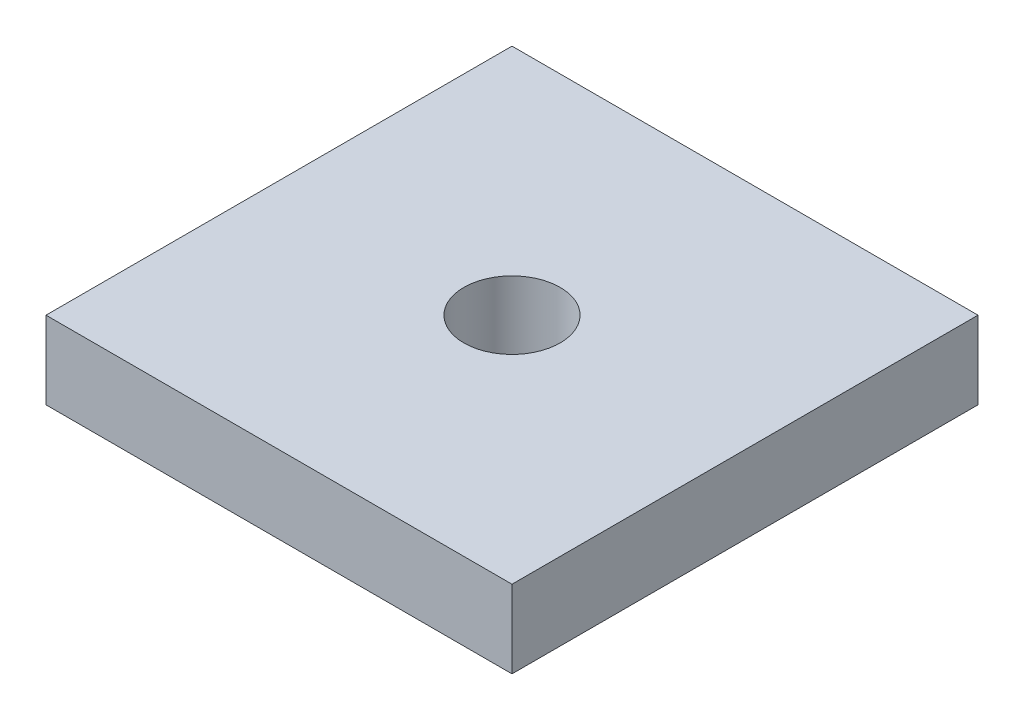
ISO-10303-21;
HEADER;
FILE_DESCRIPTION(('STEP AP214'),'2;1');
FILE_NAME('part.step','',(''),(''),'','','');
FILE_SCHEMA(('AUTOMOTIVE_DESIGN { 1 0 10303 214 1 1 1 1 }'));
ENDSEC;
DATA;
#1=APPLICATION_CONTEXT('core data for automotive mechanical design processes');
#2=APPLICATION_PROTOCOL_DEFINITION('international standard','automotive_design',2000,#1);
#3=PRODUCT_CONTEXT('',#1,'mechanical');
#4=PRODUCT('Part','Part','',(#3));
#5=PRODUCT_RELATED_PRODUCT_CATEGORY('part','',(#4));
#6=PRODUCT_DEFINITION_FORMATION('','',#4);
#7=PRODUCT_DEFINITION_CONTEXT('part definition',#1,'design');
#8=PRODUCT_DEFINITION('design','',#6,#7);
#9=PRODUCT_DEFINITION_SHAPE('','',#8);
#10=(LENGTH_UNIT() NAMED_UNIT(*) SI_UNIT(.MILLI.,.METRE.));
#11=(NAMED_UNIT(*) PLANE_ANGLE_UNIT() SI_UNIT($,.RADIAN.));
#12=(NAMED_UNIT(*) SI_UNIT($,.STERADIAN.) SOLID_ANGLE_UNIT());
#13=UNCERTAINTY_MEASURE_WITH_UNIT(LENGTH_MEASURE(1.E-05),#10,'distance_accuracy_value','');
#14=(GEOMETRIC_REPRESENTATION_CONTEXT(3) GLOBAL_UNCERTAINTY_ASSIGNED_CONTEXT((#13)) GLOBAL_UNIT_ASSIGNED_CONTEXT((#10,
#11,#12)) REPRESENTATION_CONTEXT('',''));
#15=CARTESIAN_POINT('',(0.,0.,0.));
#16=DIRECTION('',(0.,0.,1.));
#17=DIRECTION('',(1.,0.,0.));
#18=AXIS2_PLACEMENT_3D('',#15,#16,#17);
#19=CARTESIAN_POINT('',(0.,5.,0.));
#20=DIRECTION('',(0.,-1.,0.));
#21=DIRECTION('',(0.,0.,-1.));
#22=AXIS2_PLACEMENT_3D('',#19,#20,#21);
#23=PLANE('',#22);
#24=DIRECTION('',(0.,0.,-1.));
#25=VECTOR('',#24,1.);
#26=CARTESIAN_POINT('',(15.,5.,15.));
#27=LINE('',#26,#25);
#28=CARTESIAN_POINT('',(15.,5.,15.));
#29=VERTEX_POINT('',#28);
#30=CARTESIAN_POINT('',(15.,5.,-15.));
#31=VERTEX_POINT('',#30);
#32=EDGE_CURVE('E96',#29,#31,#27,.T.);
#33=ORIENTED_EDGE('',*,*,#32,.T.);
#34=DIRECTION('',(-1.,0.,0.));
#35=VECTOR('',#34,1.);
#36=CARTESIAN_POINT('',(-15.,5.,-15.));
#37=LINE('',#36,#35);
#38=CARTESIAN_POINT('',(-15.,5.,-15.));
#39=VERTEX_POINT('',#38);
#40=EDGE_CURVE('E91',#31,#39,#37,.T.);
#41=ORIENTED_EDGE('',*,*,#40,.T.);
#42=DIRECTION('',(0.,0.,1.));
#43=VECTOR('',#42,1.);
#44=CARTESIAN_POINT('',(-15.,5.,15.));
#45=LINE('',#44,#43);
#46=CARTESIAN_POINT('',(-15.,5.,15.));
#47=VERTEX_POINT('',#46);
#48=EDGE_CURVE('E94',#39,#47,#45,.T.);
#49=ORIENTED_EDGE('',*,*,#48,.T.);
#50=DIRECTION('',(1.,0.,0.));
#51=VECTOR('',#50,1.);
#52=CARTESIAN_POINT('',(-15.,5.,15.));
#53=LINE('',#52,#51);
#54=EDGE_CURVE('E61',#47,#29,#53,.T.);
#55=ORIENTED_EDGE('',*,*,#54,.T.);
#56=EDGE_LOOP('',(#33,#41,#49,#55));
#57=FACE_BOUND('',#56,.T.);
#58=CARTESIAN_POINT('',(0.,5.,0.));
#59=DIRECTION('',(0.,1.,0.));
#60=DIRECTION('',(0.,0.,1.));
#61=AXIS2_PLACEMENT_3D('',#58,#59,#60);
#62=CIRCLE('',#61,3.1);
#63=CARTESIAN_POINT('',(0.,5.,3.1));
#64=VERTEX_POINT('',#63);
#65=EDGE_CURVE('E116',#64,#64,#62,.T.);
#66=ORIENTED_EDGE('',*,*,#65,.F.);
#67=EDGE_LOOP('',(#66));
#68=FACE_BOUND('',#67,.T.);
#69=ADVANCED_FACE('F43',(#57,#68),#23,.F.);
#70=CARTESIAN_POINT('',(0.,0.,0.));
#71=DIRECTION('',(0.,-1.,0.));
#72=DIRECTION('',(0.,0.,-1.));
#73=AXIS2_PLACEMENT_3D('',#70,#71,#72);
#74=PLANE('',#73);
#75=DIRECTION('',(0.,0.,-1.));
#76=VECTOR('',#75,1.);
#77=CARTESIAN_POINT('',(15.,0.,15.));
#78=LINE('',#77,#76);
#79=CARTESIAN_POINT('',(15.,0.,15.));
#80=VERTEX_POINT('',#79);
#81=CARTESIAN_POINT('',(15.,0.,-15.));
#82=VERTEX_POINT('',#81);
#83=EDGE_CURVE('E112',#80,#82,#78,.T.);
#84=ORIENTED_EDGE('',*,*,#83,.F.);
#85=DIRECTION('',(1.,0.,0.));
#86=VECTOR('',#85,1.);
#87=CARTESIAN_POINT('',(-15.,0.,15.));
#88=LINE('',#87,#86);
#89=CARTESIAN_POINT('',(-15.,0.,15.));
#90=VERTEX_POINT('',#89);
#91=EDGE_CURVE('E84',#90,#80,#88,.T.);
#92=ORIENTED_EDGE('',*,*,#91,.F.);
#93=DIRECTION('',(0.,0.,1.));
#94=VECTOR('',#93,1.);
#95=CARTESIAN_POINT('',(-15.,0.,15.));
#96=LINE('',#95,#94);
#97=CARTESIAN_POINT('',(-15.,0.,-15.));
#98=VERTEX_POINT('',#97);
#99=EDGE_CURVE('E78',#98,#90,#96,.T.);
#100=ORIENTED_EDGE('',*,*,#99,.F.);
#101=DIRECTION('',(-1.,0.,0.));
#102=VECTOR('',#101,1.);
#103=CARTESIAN_POINT('',(-15.,0.,-15.));
#104=LINE('',#103,#102);
#105=EDGE_CURVE('E101',#82,#98,#104,.T.);
#106=ORIENTED_EDGE('',*,*,#105,.F.);
#107=EDGE_LOOP('',(#84,#92,#100,#106));
#108=FACE_BOUND('',#107,.T.);
#109=CARTESIAN_POINT('',(0.,0.,0.));
#110=DIRECTION('',(0.,1.,0.));
#111=DIRECTION('',(0.,0.,1.));
#112=AXIS2_PLACEMENT_3D('',#109,#110,#111);
#113=CIRCLE('',#112,3.1);
#114=CARTESIAN_POINT('',(0.,0.,3.1));
#115=VERTEX_POINT('',#114);
#116=EDGE_CURVE('E134',#115,#115,#113,.T.);
#117=ORIENTED_EDGE('',*,*,#116,.T.);
#118=EDGE_LOOP('',(#117));
#119=FACE_BOUND('',#118,.T.);
#120=ADVANCED_FACE('F129',(#108,#119),#74,.T.);
#121=CARTESIAN_POINT('',(15.,5.,15.));
#122=DIRECTION('',(-1.,0.,0.));
#123=DIRECTION('',(0.,0.,1.));
#124=AXIS2_PLACEMENT_3D('',#121,#122,#123);
#125=PLANE('',#124);
#126=ORIENTED_EDGE('',*,*,#83,.T.);
#127=DIRECTION('',(0.,-1.,0.));
#128=VECTOR('',#127,1.);
#129=CARTESIAN_POINT('',(15.,5.,-15.));
#130=LINE('',#129,#128);
#131=EDGE_CURVE('E11',#31,#82,#130,.T.);
#132=ORIENTED_EDGE('',*,*,#131,.F.);
#133=ORIENTED_EDGE('',*,*,#32,.F.);
#134=DIRECTION('',(0.,-1.,0.));
#135=VECTOR('',#134,1.);
#136=CARTESIAN_POINT('',(15.,5.,15.));
#137=LINE('',#136,#135);
#138=EDGE_CURVE('E108',#29,#80,#137,.T.);
#139=ORIENTED_EDGE('',*,*,#138,.T.);
#140=EDGE_LOOP('',(#126,#132,#133,#139));
#141=FACE_BOUND('',#140,.T.);
#142=ADVANCED_FACE('F45',(#141),#125,.F.);
#143=CARTESIAN_POINT('',(-15.,5.,-15.));
#144=DIRECTION('',(0.,0.,1.));
#145=DIRECTION('',(1.,0.,0.));
#146=AXIS2_PLACEMENT_3D('',#143,#144,#145);
#147=PLANE('',#146);
#148=ORIENTED_EDGE('',*,*,#105,.T.);
#149=DIRECTION('',(0.,-1.,0.));
#150=VECTOR('',#149,1.);
#151=CARTESIAN_POINT('',(-15.,5.,-15.));
#152=LINE('',#151,#150);
#153=EDGE_CURVE('E53',#39,#98,#152,.T.);
#154=ORIENTED_EDGE('',*,*,#153,.F.);
#155=ORIENTED_EDGE('',*,*,#40,.F.);
#156=ORIENTED_EDGE('',*,*,#131,.T.);
#157=EDGE_LOOP('',(#148,#154,#155,#156));
#158=FACE_BOUND('',#157,.T.);
#159=ADVANCED_FACE('F100',(#158),#147,.F.);
#160=CARTESIAN_POINT('',(-15.,5.,15.));
#161=DIRECTION('',(1.,0.,0.));
#162=DIRECTION('',(0.,0.,-1.));
#163=AXIS2_PLACEMENT_3D('',#160,#161,#162);
#164=PLANE('',#163);
#165=ORIENTED_EDGE('',*,*,#99,.T.);
#166=DIRECTION('',(0.,-1.,0.));
#167=VECTOR('',#166,1.);
#168=CARTESIAN_POINT('',(-15.,5.,15.));
#169=LINE('',#168,#167);
#170=EDGE_CURVE('E103',#47,#90,#169,.T.);
#171=ORIENTED_EDGE('',*,*,#170,.F.);
#172=ORIENTED_EDGE('',*,*,#48,.F.);
#173=ORIENTED_EDGE('',*,*,#153,.T.);
#174=EDGE_LOOP('',(#165,#171,#172,#173));
#175=FACE_BOUND('',#174,.T.);
#176=ADVANCED_FACE('F104',(#175),#164,.F.);
#177=CARTESIAN_POINT('',(-15.,5.,15.));
#178=DIRECTION('',(0.,0.,-1.));
#179=DIRECTION('',(-1.,0.,0.));
#180=AXIS2_PLACEMENT_3D('',#177,#178,#179);
#181=PLANE('',#180);
#182=ORIENTED_EDGE('',*,*,#91,.T.);
#183=ORIENTED_EDGE('',*,*,#138,.F.);
#184=ORIENTED_EDGE('',*,*,#54,.F.);
#185=ORIENTED_EDGE('',*,*,#170,.T.);
#186=EDGE_LOOP('',(#182,#183,#184,#185));
#187=FACE_BOUND('',#186,.T.);
#188=ADVANCED_FACE('F126',(#187),#181,.F.);
#189=CARTESIAN_POINT('',(0.,5.,0.));
#190=DIRECTION('',(0.,-1.,0.));
#191=DIRECTION('',(0.,0.,-1.));
#192=AXIS2_PLACEMENT_3D('',#189,#190,#191);
#193=CYLINDRICAL_SURFACE('',#192,3.1);
#194=ORIENTED_EDGE('',*,*,#65,.T.);
#195=EDGE_LOOP('',(#194));
#196=FACE_BOUND('',#195,.T.);
#197=ORIENTED_EDGE('',*,*,#116,.F.);
#198=EDGE_LOOP('',(#197));
#199=FACE_BOUND('',#198,.T.);
#200=ADVANCED_FACE('F142',(#196,#199),#193,.F.);
#201=CLOSED_SHELL('',(#69,#120,#142,#159,#176,#188,#200));
#202=MANIFOLD_SOLID_BREP('B2',#201);
#203=ADVANCED_BREP_SHAPE_REPRESENTATION('',(#18,#202),#14);
#204=SHAPE_DEFINITION_REPRESENTATION(#9,#203);
ENDSEC;
END-ISO-10303-21;
